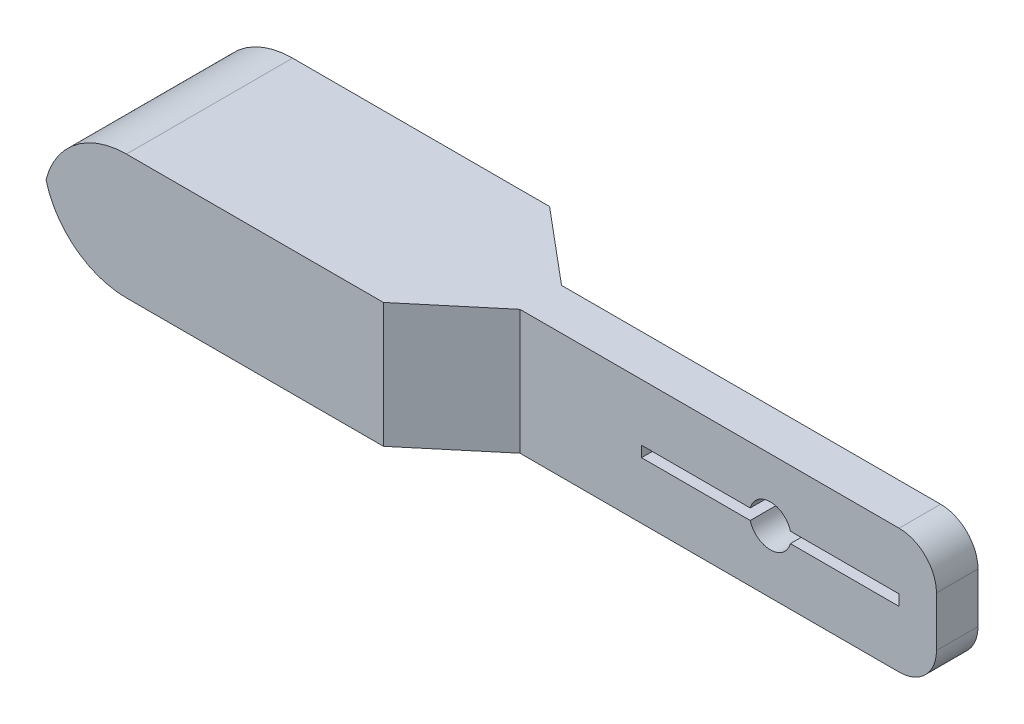
ISO-10303-21;
HEADER;
FILE_DESCRIPTION(('STEP AP214'),'2;1');
FILE_NAME('part.step','',(''),(''),'','','');
FILE_SCHEMA(('AUTOMOTIVE_DESIGN { 1 0 10303 214 1 1 1 1 }'));
ENDSEC;
DATA;
#1=APPLICATION_CONTEXT('core data for automotive mechanical design processes');
#2=APPLICATION_PROTOCOL_DEFINITION('international standard','automotive_design',2000,#1);
#3=PRODUCT_CONTEXT('',#1,'mechanical');
#4=PRODUCT('Part','Part','',(#3));
#5=PRODUCT_RELATED_PRODUCT_CATEGORY('part','',(#4));
#6=PRODUCT_DEFINITION_FORMATION('','',#4);
#7=PRODUCT_DEFINITION_CONTEXT('part definition',#1,'design');
#8=PRODUCT_DEFINITION('design','',#6,#7);
#9=PRODUCT_DEFINITION_SHAPE('','',#8);
#10=(LENGTH_UNIT() NAMED_UNIT(*) SI_UNIT(.MILLI.,.METRE.));
#11=(NAMED_UNIT(*) PLANE_ANGLE_UNIT() SI_UNIT($,.RADIAN.));
#12=(NAMED_UNIT(*) SI_UNIT($,.STERADIAN.) SOLID_ANGLE_UNIT());
#13=UNCERTAINTY_MEASURE_WITH_UNIT(LENGTH_MEASURE(1.E-05),#10,'distance_accuracy_value','');
#14=(GEOMETRIC_REPRESENTATION_CONTEXT(3) GLOBAL_UNCERTAINTY_ASSIGNED_CONTEXT((#13)) GLOBAL_UNIT_ASSIGNED_CONTEXT((#10,
#11,#12)) REPRESENTATION_CONTEXT('',''));
#15=CARTESIAN_POINT('',(0.,0.,0.));
#16=DIRECTION('',(0.,0.,1.));
#17=DIRECTION('',(1.,0.,0.));
#18=AXIS2_PLACEMENT_3D('',#15,#16,#17);
#19=CARTESIAN_POINT('',(0.,-6.,3.));
#20=DIRECTION('',(0.,-1.,0.));
#21=DIRECTION('',(0.,0.,1.));
#22=AXIS2_PLACEMENT_3D('',#19,#20,#21);
#23=PLANE('',#22);
#24=DIRECTION('',(1.,0.,0.));
#25=VECTOR('',#24,1.);
#26=CARTESIAN_POINT('',(0.,-6.,3.));
#27=LINE('',#26,#25);
#28=CARTESIAN_POINT('',(-27.629905537051,-6.,3.));
#29=VERTEX_POINT('',#28);
#30=CARTESIAN_POINT('',(18.,-6.,3.));
#31=VERTEX_POINT('',#30);
#32=EDGE_CURVE('E254',#29,#31,#27,.T.);
#33=ORIENTED_EDGE('',*,*,#32,.F.);
#34=DIRECTION('',(0.766044443118981,0.,-0.642787609686536));
#35=VECTOR('',#34,1.);
#36=CARTESIAN_POINT('',(-11.4160113957162,-6.,-10.6050725939414));
#37=LINE('',#36,#35);
#38=CARTESIAN_POINT('',(-36.5680574815077,-6.,10.5));
#39=VERTEX_POINT('',#38);
#40=EDGE_CURVE('E267',#39,#29,#37,.T.);
#41=ORIENTED_EDGE('',*,*,#40,.F.);
#42=DIRECTION('',(1.,0.,0.));
#43=VECTOR('',#42,1.);
#44=CARTESIAN_POINT('',(-77.5,-6.,10.5));
#45=LINE('',#44,#43);
#46=CARTESIAN_POINT('',(-67.5,-6.,10.5));
#47=VERTEX_POINT('',#46);
#48=EDGE_CURVE('E194',#47,#39,#45,.T.);
#49=ORIENTED_EDGE('',*,*,#48,.F.);
#50=DIRECTION('',(0.,0.,-1.));
#51=VECTOR('',#50,1.);
#52=CARTESIAN_POINT('',(-67.5,-6.,10.5));
#53=LINE('',#52,#51);
#54=CARTESIAN_POINT('',(-67.5,-6.,-9.5));
#55=VERTEX_POINT('',#54);
#56=EDGE_CURVE('E295',#55,#47,#53,.F.);
#57=ORIENTED_EDGE('',*,*,#56,.F.);
#58=DIRECTION('',(1.,0.,0.));
#59=VECTOR('',#58,1.);
#60=CARTESIAN_POINT('',(-77.5,-6.,-9.5));
#61=LINE('',#60,#59);
#62=CARTESIAN_POINT('',(-36.5680574815077,-6.,-9.5));
#63=VERTEX_POINT('',#62);
#64=EDGE_CURVE('E199',#55,#63,#61,.T.);
#65=ORIENTED_EDGE('',*,*,#64,.T.);
#66=DIRECTION('',(-0.766044443118981,0.,-0.642787609686536));
#67=VECTOR('',#66,1.);
#68=CARTESIAN_POINT('',(-8.9539920131857,-6.,13.670952149774));
#69=LINE('',#68,#67);
#70=CARTESIAN_POINT('',(-27.629905537051,-6.,-2.));
#71=VERTEX_POINT('',#70);
#72=EDGE_CURVE('E264',#71,#63,#69,.T.);
#73=ORIENTED_EDGE('',*,*,#72,.F.);
#74=DIRECTION('',(1.,0.,0.));
#75=VECTOR('',#74,1.);
#76=CARTESIAN_POINT('',(-17.5,-6.,-2.));
#77=LINE('',#76,#75);
#78=CARTESIAN_POINT('',(18.,-6.,-2.));
#79=VERTEX_POINT('',#78);
#80=EDGE_CURVE('E232',#71,#79,#77,.T.);
#81=ORIENTED_EDGE('',*,*,#80,.T.);
#82=DIRECTION('',(0.,0.,-1.));
#83=VECTOR('',#82,1.);
#84=CARTESIAN_POINT('',(18.,-6.,3.));
#85=LINE('',#84,#83);
#86=EDGE_CURVE('E298',#31,#79,#85,.T.);
#87=ORIENTED_EDGE('',*,*,#86,.F.);
#88=EDGE_LOOP('',(#33,#41,#49,#57,#65,#73,#81,#87));
#89=FACE_BOUND('',#88,.T.);
#90=ADVANCED_FACE('F37',(#89),#23,.T.);
#91=CARTESIAN_POINT('',(0.,9.,3.));
#92=DIRECTION('',(0.,-1.,0.));
#93=DIRECTION('',(0.,0.,1.));
#94=AXIS2_PLACEMENT_3D('',#91,#92,#93);
#95=PLANE('',#94);
#96=DIRECTION('',(-1.,0.,0.));
#97=VECTOR('',#96,1.);
#98=CARTESIAN_POINT('',(-17.5,9.,-2.));
#99=LINE('',#98,#97);
#100=CARTESIAN_POINT('',(18.,9.,-2.));
#101=VERTEX_POINT('',#100);
#102=CARTESIAN_POINT('',(-27.629905537051,9.,-2.));
#103=VERTEX_POINT('',#102);
#104=EDGE_CURVE('E251',#101,#103,#99,.T.);
#105=ORIENTED_EDGE('',*,*,#104,.T.);
#106=DIRECTION('',(0.766044443118981,0.,0.642787609686536));
#107=VECTOR('',#106,1.);
#108=CARTESIAN_POINT('',(-36.5680574815077,9.,-9.5));
#109=LINE('',#108,#107);
#110=CARTESIAN_POINT('',(-36.5680574815077,9.,-9.5));
#111=VERTEX_POINT('',#110);
#112=EDGE_CURVE('E270',#111,#103,#109,.T.);
#113=ORIENTED_EDGE('',*,*,#112,.F.);
#114=DIRECTION('',(1.,0.,0.));
#115=VECTOR('',#114,1.);
#116=CARTESIAN_POINT('',(-77.5,9.,-9.5));
#117=LINE('',#116,#115);
#118=CARTESIAN_POINT('',(-67.5,9.,-9.5));
#119=VERTEX_POINT('',#118);
#120=EDGE_CURVE('E340',#119,#111,#117,.T.);
#121=ORIENTED_EDGE('',*,*,#120,.F.);
#122=DIRECTION('',(0.,0.,1.));
#123=VECTOR('',#122,1.);
#124=CARTESIAN_POINT('',(-67.5,9.,3.));
#125=LINE('',#124,#123);
#126=CARTESIAN_POINT('',(-67.5,9.,10.5));
#127=VERTEX_POINT('',#126);
#128=EDGE_CURVE('E287',#127,#119,#125,.F.);
#129=ORIENTED_EDGE('',*,*,#128,.F.);
#130=DIRECTION('',(1.,0.,0.));
#131=VECTOR('',#130,1.);
#132=CARTESIAN_POINT('',(-77.5,9.,10.5));
#133=LINE('',#132,#131);
#134=CARTESIAN_POINT('',(-36.5680574815077,9.,10.5));
#135=VERTEX_POINT('',#134);
#136=EDGE_CURVE('E301',#127,#135,#133,.T.);
#137=ORIENTED_EDGE('',*,*,#136,.T.);
#138=DIRECTION('',(-0.766044443118981,0.,0.642787609686536));
#139=VECTOR('',#138,1.);
#140=CARTESIAN_POINT('',(-36.5680574815077,9.,10.5));
#141=LINE('',#140,#139);
#142=CARTESIAN_POINT('',(-27.629905537051,9.,3.));
#143=VERTEX_POINT('',#142);
#144=EDGE_CURVE('E273',#143,#135,#141,.T.);
#145=ORIENTED_EDGE('',*,*,#144,.F.);
#146=DIRECTION('',(1.,0.,0.));
#147=VECTOR('',#146,1.);
#148=CARTESIAN_POINT('',(0.,9.,3.));
#149=LINE('',#148,#147);
#150=CARTESIAN_POINT('',(18.,9.,3.));
#151=VERTEX_POINT('',#150);
#152=EDGE_CURVE('E259',#143,#151,#149,.T.);
#153=ORIENTED_EDGE('',*,*,#152,.T.);
#154=DIRECTION('',(0.,0.,-1.));
#155=VECTOR('',#154,1.);
#156=CARTESIAN_POINT('',(18.,9.,3.));
#157=LINE('',#156,#155);
#158=EDGE_CURVE('E11',#101,#151,#157,.F.);
#159=ORIENTED_EDGE('',*,*,#158,.F.);
#160=EDGE_LOOP('',(#105,#113,#121,#129,#137,#145,#153,#159));
#161=FACE_BOUND('',#160,.T.);
#162=ADVANCED_FACE('F346',(#161),#95,.F.);
#163=CARTESIAN_POINT('',(22.5,0.,3.));
#164=DIRECTION('',(1.,0.,0.));
#165=DIRECTION('',(0.,0.,1.));
#166=AXIS2_PLACEMENT_3D('',#163,#164,#165);
#167=PLANE('',#166);
#168=DIRECTION('',(0.,1.,0.));
#169=VECTOR('',#168,1.);
#170=CARTESIAN_POINT('',(22.5,-6.,-2.));
#171=LINE('',#170,#169);
#172=CARTESIAN_POINT('',(22.5,-1.5,-2.));
#173=VERTEX_POINT('',#172);
#174=CARTESIAN_POINT('',(22.5,4.5,-2.));
#175=VERTEX_POINT('',#174);
#176=EDGE_CURVE('E248',#173,#175,#171,.T.);
#177=ORIENTED_EDGE('',*,*,#176,.T.);
#178=DIRECTION('',(0.,0.,-1.));
#179=VECTOR('',#178,1.);
#180=CARTESIAN_POINT('',(22.5,4.5,-2.));
#181=LINE('',#180,#179);
#182=CARTESIAN_POINT('',(22.5,4.5,3.));
#183=VERTEX_POINT('',#182);
#184=EDGE_CURVE('E308',#183,#175,#181,.T.);
#185=ORIENTED_EDGE('',*,*,#184,.F.);
#186=DIRECTION('',(0.,1.,0.));
#187=VECTOR('',#186,1.);
#188=CARTESIAN_POINT('',(22.5,0.,3.));
#189=LINE('',#188,#187);
#190=CARTESIAN_POINT('',(22.5,-1.5,3.));
#191=VERTEX_POINT('',#190);
#192=EDGE_CURVE('E257',#191,#183,#189,.T.);
#193=ORIENTED_EDGE('',*,*,#192,.F.);
#194=DIRECTION('',(0.,0.,-1.));
#195=VECTOR('',#194,1.);
#196=CARTESIAN_POINT('',(22.5,-1.5,3.));
#197=LINE('',#196,#195);
#198=EDGE_CURVE('E310',#173,#191,#197,.F.);
#199=ORIENTED_EDGE('',*,*,#198,.F.);
#200=EDGE_LOOP('',(#177,#185,#193,#199));
#201=FACE_BOUND('',#200,.T.);
#202=ADVANCED_FACE('F359',(#201),#167,.T.);
#203=CARTESIAN_POINT('',(0.,0.,3.));
#204=DIRECTION('',(0.,0.,-1.));
#205=DIRECTION('',(1.,0.,0.));
#206=AXIS2_PLACEMENT_3D('',#203,#204,#205);
#207=PLANE('',#206);
#208=DIRECTION('',(-1.,0.,0.));
#209=VECTOR('',#208,1.);
#210=CARTESIAN_POINT('',(0.0859784590853366,0.850000000000001,3.));
#211=LINE('',#210,#209);
#212=CARTESIAN_POINT('',(0.0859784590853366,0.850000000000001,3.));
#213=VERTEX_POINT('',#212);
#214=CARTESIAN_POINT('',(-13.,0.849999999999999,3.));
#215=VERTEX_POINT('',#214);
#216=EDGE_CURVE('E210',#213,#215,#211,.T.);
#217=ORIENTED_EDGE('',*,*,#216,.T.);
#218=DIRECTION('',(0.,1.,0.));
#219=VECTOR('',#218,1.);
#220=CARTESIAN_POINT('',(-13.,2.15,3.));
#221=LINE('',#220,#219);
#222=CARTESIAN_POINT('',(-13.,2.15,3.));
#223=VERTEX_POINT('',#222);
#224=EDGE_CURVE('E207',#215,#223,#221,.T.);
#225=ORIENTED_EDGE('',*,*,#224,.T.);
#226=DIRECTION('',(1.,0.,0.));
#227=VECTOR('',#226,1.);
#228=CARTESIAN_POINT('',(0.0859784590853366,2.15,3.));
#229=LINE('',#228,#227);
#230=CARTESIAN_POINT('',(0.085978459085337,2.15,3.));
#231=VERTEX_POINT('',#230);
#232=EDGE_CURVE('E204',#223,#231,#229,.T.);
#233=ORIENTED_EDGE('',*,*,#232,.T.);
#234=CARTESIAN_POINT('',(2.5,1.5,3.));
#235=DIRECTION('',(0.,0.,1.));
#236=DIRECTION('',(1.,0.,0.));
#237=AXIS2_PLACEMENT_3D('',#234,#235,#236);
#238=CIRCLE('',#237,2.5);
#239=CARTESIAN_POINT('',(4.91402154091466,2.15,3.));
#240=VERTEX_POINT('',#239);
#241=EDGE_CURVE('E196',#231,#240,#238,.F.);
#242=ORIENTED_EDGE('',*,*,#241,.T.);
#243=DIRECTION('',(1.,0.,0.));
#244=VECTOR('',#243,1.);
#245=CARTESIAN_POINT('',(18.,2.15,3.));
#246=LINE('',#245,#244);
#247=CARTESIAN_POINT('',(18.,2.15,3.));
#248=VERTEX_POINT('',#247);
#249=EDGE_CURVE('E193',#240,#248,#246,.T.);
#250=ORIENTED_EDGE('',*,*,#249,.T.);
#251=DIRECTION('',(0.,-1.,0.));
#252=VECTOR('',#251,1.);
#253=CARTESIAN_POINT('',(18.,2.15,3.));
#254=LINE('',#253,#252);
#255=CARTESIAN_POINT('',(18.,0.850000000000004,3.));
#256=VERTEX_POINT('',#255);
#257=EDGE_CURVE('E170',#248,#256,#254,.T.);
#258=ORIENTED_EDGE('',*,*,#257,.T.);
#259=DIRECTION('',(-1.,0.,0.));
#260=VECTOR('',#259,1.);
#261=CARTESIAN_POINT('',(18.,0.850000000000004,3.));
#262=LINE('',#261,#260);
#263=CARTESIAN_POINT('',(4.91402154091466,0.850000000000001,3.));
#264=VERTEX_POINT('',#263);
#265=EDGE_CURVE('E181',#256,#264,#262,.T.);
#266=ORIENTED_EDGE('',*,*,#265,.T.);
#267=CARTESIAN_POINT('',(2.5,1.5,3.));
#268=DIRECTION('',(0.,0.,1.));
#269=DIRECTION('',(1.,0.,0.));
#270=AXIS2_PLACEMENT_3D('',#267,#268,#269);
#271=CIRCLE('',#270,2.5);
#272=EDGE_CURVE('E187',#264,#213,#271,.F.);
#273=ORIENTED_EDGE('',*,*,#272,.T.);
#274=EDGE_LOOP('',(#217,#225,#233,#242,#250,#258,#266,#273));
#275=FACE_BOUND('',#274,.T.);
#276=ORIENTED_EDGE('',*,*,#192,.T.);
#277=CARTESIAN_POINT('',(18.,4.5,3.));
#278=DIRECTION('',(0.,0.,1.));
#279=DIRECTION('',(1.,0.,0.));
#280=AXIS2_PLACEMENT_3D('',#277,#278,#279);
#281=CIRCLE('',#280,4.5);
#282=EDGE_CURVE('E52',#151,#183,#281,.F.);
#283=ORIENTED_EDGE('',*,*,#282,.F.);
#284=ORIENTED_EDGE('',*,*,#152,.F.);
#285=DIRECTION('',(0.,1.,0.));
#286=VECTOR('',#285,1.);
#287=CARTESIAN_POINT('',(-27.629905537051,0.,3.));
#288=LINE('',#287,#286);
#289=EDGE_CURVE('E278',#29,#143,#288,.T.);
#290=ORIENTED_EDGE('',*,*,#289,.F.);
#291=ORIENTED_EDGE('',*,*,#32,.T.);
#292=CARTESIAN_POINT('',(18.,-1.5,3.));
#293=DIRECTION('',(0.,0.,1.));
#294=DIRECTION('',(1.,0.,0.));
#295=AXIS2_PLACEMENT_3D('',#292,#293,#294);
#296=CIRCLE('',#295,4.5);
#297=EDGE_CURVE('E45',#191,#31,#296,.F.);
#298=ORIENTED_EDGE('',*,*,#297,.F.);
#299=EDGE_LOOP('',(#276,#283,#284,#290,#291,#298));
#300=FACE_BOUND('',#299,.T.);
#301=ADVANCED_FACE('F190',(#275,#300),#207,.F.);
#302=CARTESIAN_POINT('',(0.,0.,-2.));
#303=DIRECTION('',(0.,0.,1.));
#304=DIRECTION('',(-1.,0.,0.));
#305=AXIS2_PLACEMENT_3D('',#302,#303,#304);
#306=PLANE('',#305);
#307=DIRECTION('',(-1.,0.,0.));
#308=VECTOR('',#307,1.);
#309=CARTESIAN_POINT('',(0.0859784590853366,0.850000000000001,-2.));
#310=LINE('',#309,#308);
#311=CARTESIAN_POINT('',(0.0859784590853362,0.850000000000001,-2.));
#312=VERTEX_POINT('',#311);
#313=CARTESIAN_POINT('',(-13.,0.85,-2.));
#314=VERTEX_POINT('',#313);
#315=EDGE_CURVE('E217',#312,#314,#310,.T.);
#316=ORIENTED_EDGE('',*,*,#315,.F.);
#317=CARTESIAN_POINT('',(2.5,1.5,-2.));
#318=DIRECTION('',(0.,0.,-1.));
#319=DIRECTION('',(-1.,0.,0.));
#320=AXIS2_PLACEMENT_3D('',#317,#318,#319);
#321=CIRCLE('',#320,2.5);
#322=CARTESIAN_POINT('',(4.91402154091466,0.850000000000001,-2.));
#323=VERTEX_POINT('',#322);
#324=EDGE_CURVE('E229',#323,#312,#321,.T.);
#325=ORIENTED_EDGE('',*,*,#324,.F.);
#326=DIRECTION('',(-1.,0.,0.));
#327=VECTOR('',#326,1.);
#328=CARTESIAN_POINT('',(18.,0.850000000000004,-2.));
#329=LINE('',#328,#327);
#330=CARTESIAN_POINT('',(18.,0.850000000000003,-2.));
#331=VERTEX_POINT('',#330);
#332=EDGE_CURVE('E227',#331,#323,#329,.T.);
#333=ORIENTED_EDGE('',*,*,#332,.F.);
#334=DIRECTION('',(0.,-1.,0.));
#335=VECTOR('',#334,1.);
#336=CARTESIAN_POINT('',(18.,2.15,-2.));
#337=LINE('',#336,#335);
#338=CARTESIAN_POINT('',(18.,2.15,-2.));
#339=VERTEX_POINT('',#338);
#340=EDGE_CURVE('E173',#339,#331,#337,.T.);
#341=ORIENTED_EDGE('',*,*,#340,.F.);
#342=DIRECTION('',(1.,0.,0.));
#343=VECTOR('',#342,1.);
#344=CARTESIAN_POINT('',(18.,2.15,-2.));
#345=LINE('',#344,#343);
#346=CARTESIAN_POINT('',(4.91402154091466,2.15,-2.));
#347=VERTEX_POINT('',#346);
#348=EDGE_CURVE('E223',#347,#339,#345,.T.);
#349=ORIENTED_EDGE('',*,*,#348,.F.);
#350=CARTESIAN_POINT('',(2.5,1.5,-2.));
#351=DIRECTION('',(0.,0.,-1.));
#352=DIRECTION('',(-1.,0.,0.));
#353=AXIS2_PLACEMENT_3D('',#350,#351,#352);
#354=CIRCLE('',#353,2.5);
#355=CARTESIAN_POINT('',(0.0859784590853366,2.15,-2.));
#356=VERTEX_POINT('',#355);
#357=EDGE_CURVE('E220',#356,#347,#354,.T.);
#358=ORIENTED_EDGE('',*,*,#357,.F.);
#359=DIRECTION('',(1.,0.,0.));
#360=VECTOR('',#359,1.);
#361=CARTESIAN_POINT('',(0.0859784590853366,2.15,-2.));
#362=LINE('',#361,#360);
#363=CARTESIAN_POINT('',(-13.,2.15,-2.));
#364=VERTEX_POINT('',#363);
#365=EDGE_CURVE('E216',#364,#356,#362,.T.);
#366=ORIENTED_EDGE('',*,*,#365,.F.);
#367=DIRECTION('',(0.,1.,0.));
#368=VECTOR('',#367,1.);
#369=CARTESIAN_POINT('',(-13.,2.15,-2.));
#370=LINE('',#369,#368);
#371=EDGE_CURVE('E213',#314,#364,#370,.T.);
#372=ORIENTED_EDGE('',*,*,#371,.F.);
#373=EDGE_LOOP('',(#316,#325,#333,#341,#349,#358,#366,#372));
#374=FACE_BOUND('',#373,.T.);
#375=ORIENTED_EDGE('',*,*,#80,.F.);
#376=DIRECTION('',(0.,-1.,0.));
#377=VECTOR('',#376,1.);
#378=CARTESIAN_POINT('',(-27.629905537051,0.,-2.));
#379=LINE('',#378,#377);
#380=EDGE_CURVE('E280',#103,#71,#379,.T.);
#381=ORIENTED_EDGE('',*,*,#380,.F.);
#382=ORIENTED_EDGE('',*,*,#104,.F.);
#383=CARTESIAN_POINT('',(18.,4.5,-2.));
#384=DIRECTION('',(0.,0.,-1.));
#385=DIRECTION('',(-1.,0.,0.));
#386=AXIS2_PLACEMENT_3D('',#383,#384,#385);
#387=CIRCLE('',#386,4.5);
#388=EDGE_CURVE('E304',#175,#101,#387,.F.);
#389=ORIENTED_EDGE('',*,*,#388,.F.);
#390=ORIENTED_EDGE('',*,*,#176,.F.);
#391=CARTESIAN_POINT('',(18.,-1.5,-2.));
#392=DIRECTION('',(0.,0.,-1.));
#393=DIRECTION('',(-1.,0.,0.));
#394=AXIS2_PLACEMENT_3D('',#391,#392,#393);
#395=CIRCLE('',#394,4.5);
#396=EDGE_CURVE('E306',#79,#173,#395,.F.);
#397=ORIENTED_EDGE('',*,*,#396,.F.);
#398=EDGE_LOOP('',(#375,#381,#382,#389,#390,#397));
#399=FACE_BOUND('',#398,.T.);
#400=ADVANCED_FACE('F356',(#374,#399),#306,.F.);
#401=CARTESIAN_POINT('',(0.0859784590853366,0.850000000000001,-33.4006369362152));
#402=DIRECTION('',(0.,1.,0.));
#403=DIRECTION('',(-1.,0.,0.));
#404=AXIS2_PLACEMENT_3D('',#401,#402,#403);
#405=PLANE('',#404);
#406=DIRECTION('',(0.,0.,1.));
#407=VECTOR('',#406,1.);
#408=CARTESIAN_POINT('',(0.0859784590853366,0.850000000000001,-33.4006369362152));
#409=LINE('',#408,#407);
#410=EDGE_CURVE('E186',#312,#213,#409,.T.);
#411=ORIENTED_EDGE('',*,*,#410,.F.);
#412=ORIENTED_EDGE('',*,*,#315,.T.);
#413=DIRECTION('',(0.,0.,1.));
#414=VECTOR('',#413,1.);
#415=CARTESIAN_POINT('',(-13.,0.85,-33.4006369362152));
#416=LINE('',#415,#414);
#417=EDGE_CURVE('E234',#314,#215,#416,.T.);
#418=ORIENTED_EDGE('',*,*,#417,.T.);
#419=ORIENTED_EDGE('',*,*,#216,.F.);
#420=EDGE_LOOP('',(#411,#412,#418,#419));
#421=FACE_BOUND('',#420,.T.);
#422=ADVANCED_FACE('F451',(#421),#405,.T.);
#423=CARTESIAN_POINT('',(-13.,2.15,-33.4006369362152));
#424=DIRECTION('',(1.,0.,0.));
#425=DIRECTION('',(0.,0.,1.));
#426=AXIS2_PLACEMENT_3D('',#423,#424,#425);
#427=PLANE('',#426);
#428=ORIENTED_EDGE('',*,*,#417,.F.);
#429=ORIENTED_EDGE('',*,*,#371,.T.);
#430=DIRECTION('',(0.,0.,1.));
#431=VECTOR('',#430,1.);
#432=CARTESIAN_POINT('',(-13.,2.15,-33.4006369362152));
#433=LINE('',#432,#431);
#434=EDGE_CURVE('E236',#364,#223,#433,.T.);
#435=ORIENTED_EDGE('',*,*,#434,.T.);
#436=ORIENTED_EDGE('',*,*,#224,.F.);
#437=EDGE_LOOP('',(#428,#429,#435,#436));
#438=FACE_BOUND('',#437,.T.);
#439=ADVANCED_FACE('F442',(#438),#427,.T.);
#440=CARTESIAN_POINT('',(0.0859784590853366,2.15,-33.4006369362152));
#441=DIRECTION('',(0.,-1.,0.));
#442=DIRECTION('',(1.,0.,0.));
#443=AXIS2_PLACEMENT_3D('',#440,#441,#442);
#444=PLANE('',#443);
#445=ORIENTED_EDGE('',*,*,#434,.F.);
#446=ORIENTED_EDGE('',*,*,#365,.T.);
#447=DIRECTION('',(0.,0.,1.));
#448=VECTOR('',#447,1.);
#449=CARTESIAN_POINT('',(0.0859784590853366,2.15,-33.4006369362152));
#450=LINE('',#449,#448);
#451=EDGE_CURVE('E238',#356,#231,#450,.T.);
#452=ORIENTED_EDGE('',*,*,#451,.T.);
#453=ORIENTED_EDGE('',*,*,#232,.F.);
#454=EDGE_LOOP('',(#445,#446,#452,#453));
#455=FACE_BOUND('',#454,.T.);
#456=ADVANCED_FACE('F433',(#455),#444,.T.);
#457=CARTESIAN_POINT('',(2.5,1.5,-33.4006369362152));
#458=DIRECTION('',(0.,0.,1.));
#459=DIRECTION('',(-1.,0.,0.));
#460=AXIS2_PLACEMENT_3D('',#457,#458,#459);
#461=CYLINDRICAL_SURFACE('',#460,2.5);
#462=ORIENTED_EDGE('',*,*,#451,.F.);
#463=ORIENTED_EDGE('',*,*,#357,.T.);
#464=DIRECTION('',(0.,0.,1.));
#465=VECTOR('',#464,1.);
#466=CARTESIAN_POINT('',(4.91402154091466,2.15,-33.4006369362152));
#467=LINE('',#466,#465);
#468=EDGE_CURVE('E240',#347,#240,#467,.T.);
#469=ORIENTED_EDGE('',*,*,#468,.T.);
#470=ORIENTED_EDGE('',*,*,#241,.F.);
#471=EDGE_LOOP('',(#462,#463,#469,#470));
#472=FACE_BOUND('',#471,.T.);
#473=ADVANCED_FACE('F424',(#472),#461,.F.);
#474=CARTESIAN_POINT('',(18.,2.15,-33.4006369362152));
#475=DIRECTION('',(0.,-1.,0.));
#476=DIRECTION('',(1.,0.,0.));
#477=AXIS2_PLACEMENT_3D('',#474,#475,#476);
#478=PLANE('',#477);
#479=ORIENTED_EDGE('',*,*,#468,.F.);
#480=ORIENTED_EDGE('',*,*,#348,.T.);
#481=DIRECTION('',(0.,0.,1.));
#482=VECTOR('',#481,1.);
#483=CARTESIAN_POINT('',(18.,2.15,-33.4006369362152));
#484=LINE('',#483,#482);
#485=EDGE_CURVE('E178',#339,#248,#484,.T.);
#486=ORIENTED_EDGE('',*,*,#485,.T.);
#487=ORIENTED_EDGE('',*,*,#249,.F.);
#488=EDGE_LOOP('',(#479,#480,#486,#487));
#489=FACE_BOUND('',#488,.T.);
#490=ADVANCED_FACE('F415',(#489),#478,.T.);
#491=CARTESIAN_POINT('',(18.,2.15,-33.4006369362152));
#492=DIRECTION('',(-1.,0.,0.));
#493=DIRECTION('',(0.,0.,-1.));
#494=AXIS2_PLACEMENT_3D('',#491,#492,#493);
#495=PLANE('',#494);
#496=ORIENTED_EDGE('',*,*,#485,.F.);
#497=ORIENTED_EDGE('',*,*,#340,.T.);
#498=DIRECTION('',(0.,0.,1.));
#499=VECTOR('',#498,1.);
#500=CARTESIAN_POINT('',(18.,0.850000000000004,-33.4006369362152));
#501=LINE('',#500,#499);
#502=EDGE_CURVE('E166',#331,#256,#501,.T.);
#503=ORIENTED_EDGE('',*,*,#502,.T.);
#504=ORIENTED_EDGE('',*,*,#257,.F.);
#505=EDGE_LOOP('',(#496,#497,#503,#504));
#506=FACE_BOUND('',#505,.T.);
#507=ADVANCED_FACE('F168',(#506),#495,.T.);
#508=CARTESIAN_POINT('',(18.,0.850000000000004,-33.4006369362152));
#509=DIRECTION('',(0.,1.,0.));
#510=DIRECTION('',(-1.,0.,0.));
#511=AXIS2_PLACEMENT_3D('',#508,#509,#510);
#512=PLANE('',#511);
#513=ORIENTED_EDGE('',*,*,#502,.F.);
#514=ORIENTED_EDGE('',*,*,#332,.T.);
#515=DIRECTION('',(0.,0.,1.));
#516=VECTOR('',#515,1.);
#517=CARTESIAN_POINT('',(4.91402154091466,0.850000000000001,-33.4006369362152));
#518=LINE('',#517,#516);
#519=EDGE_CURVE('E177',#323,#264,#518,.T.);
#520=ORIENTED_EDGE('',*,*,#519,.T.);
#521=ORIENTED_EDGE('',*,*,#265,.F.);
#522=EDGE_LOOP('',(#513,#514,#520,#521));
#523=FACE_BOUND('',#522,.T.);
#524=ADVANCED_FACE('F182',(#523),#512,.T.);
#525=CARTESIAN_POINT('',(2.5,1.5,-33.4006369362152));
#526=DIRECTION('',(0.,0.,1.));
#527=DIRECTION('',(-1.,0.,0.));
#528=AXIS2_PLACEMENT_3D('',#525,#526,#527);
#529=CYLINDRICAL_SURFACE('',#528,2.5);
#530=ORIENTED_EDGE('',*,*,#519,.F.);
#531=ORIENTED_EDGE('',*,*,#324,.T.);
#532=ORIENTED_EDGE('',*,*,#410,.T.);
#533=ORIENTED_EDGE('',*,*,#272,.F.);
#534=EDGE_LOOP('',(#530,#531,#532,#533));
#535=FACE_BOUND('',#534,.T.);
#536=ADVANCED_FACE('F499',(#535),#529,.F.);
#537=CARTESIAN_POINT('',(-77.5,-6.,10.5));
#538=DIRECTION('',(0.,0.,-1.));
#539=DIRECTION('',(0.,-1.,0.));
#540=AXIS2_PLACEMENT_3D('',#537,#538,#539);
#541=PLANE('',#540);
#542=CARTESIAN_POINT('',(-67.5,4.,10.5));
#543=DIRECTION('',(0.,0.,1.));
#544=DIRECTION('',(0.,-1.,0.));
#545=AXIS2_PLACEMENT_3D('',#542,#543,#544);
#546=CIRCLE('',#545,10.);
#547=CARTESIAN_POINT('',(-77.1824583655185,1.5,10.5));
#548=VERTEX_POINT('',#547);
#549=EDGE_CURVE('E282',#47,#548,#546,.F.);
#550=ORIENTED_EDGE('',*,*,#549,.F.);
#551=ORIENTED_EDGE('',*,*,#48,.T.);
#552=DIRECTION('',(0.,-1.,0.));
#553=VECTOR('',#552,1.);
#554=CARTESIAN_POINT('',(-36.5680574815077,-6.,10.5));
#555=LINE('',#554,#553);
#556=EDGE_CURVE('E262',#135,#39,#555,.T.);
#557=ORIENTED_EDGE('',*,*,#556,.F.);
#558=ORIENTED_EDGE('',*,*,#136,.F.);
#559=CARTESIAN_POINT('',(-67.5,-0.999999999999999,10.5));
#560=DIRECTION('',(0.,0.,1.));
#561=DIRECTION('',(0.,-1.,0.));
#562=AXIS2_PLACEMENT_3D('',#559,#560,#561);
#563=CIRCLE('',#562,10.);
#564=EDGE_CURVE('E285',#548,#127,#563,.F.);
#565=ORIENTED_EDGE('',*,*,#564,.F.);
#566=EDGE_LOOP('',(#550,#551,#557,#558,#565));
#567=FACE_BOUND('',#566,.T.);
#568=ADVANCED_FACE('F330',(#567),#541,.F.);
#569=CARTESIAN_POINT('',(-77.5,-6.,-9.5));
#570=DIRECTION('',(0.,0.,1.));
#571=DIRECTION('',(0.,1.,0.));
#572=AXIS2_PLACEMENT_3D('',#569,#570,#571);
#573=PLANE('',#572);
#574=ORIENTED_EDGE('',*,*,#120,.T.);
#575=DIRECTION('',(0.,1.,0.));
#576=VECTOR('',#575,1.);
#577=CARTESIAN_POINT('',(-36.5680574815077,9.,-9.5));
#578=LINE('',#577,#576);
#579=EDGE_CURVE('E276',#63,#111,#578,.T.);
#580=ORIENTED_EDGE('',*,*,#579,.F.);
#581=ORIENTED_EDGE('',*,*,#64,.F.);
#582=CARTESIAN_POINT('',(-67.5,4.,-9.5));
#583=DIRECTION('',(0.,0.,-1.));
#584=DIRECTION('',(0.,1.,0.));
#585=AXIS2_PLACEMENT_3D('',#582,#583,#584);
#586=CIRCLE('',#585,10.);
#587=CARTESIAN_POINT('',(-77.1824583655185,1.5,-9.5));
#588=VERTEX_POINT('',#587);
#589=EDGE_CURVE('E290',#588,#55,#586,.F.);
#590=ORIENTED_EDGE('',*,*,#589,.F.);
#591=CARTESIAN_POINT('',(-67.5,-0.999999999999999,-9.5));
#592=DIRECTION('',(0.,0.,-1.));
#593=DIRECTION('',(0.,1.,0.));
#594=AXIS2_PLACEMENT_3D('',#591,#592,#593);
#595=CIRCLE('',#594,10.);
#596=EDGE_CURVE('E292',#119,#588,#595,.F.);
#597=ORIENTED_EDGE('',*,*,#596,.F.);
#598=EDGE_LOOP('',(#574,#580,#581,#590,#597));
#599=FACE_BOUND('',#598,.T.);
#600=ADVANCED_FACE('F339',(#599),#573,.F.);
#601=CARTESIAN_POINT('',(-36.5680574815077,-6.,10.5));
#602=DIRECTION('',(0.642787609686536,0.,0.766044443118981));
#603=DIRECTION('',(0.,1.,0.));
#604=AXIS2_PLACEMENT_3D('',#601,#602,#603);
#605=PLANE('',#604);
#606=ORIENTED_EDGE('',*,*,#144,.T.);
#607=ORIENTED_EDGE('',*,*,#556,.T.);
#608=ORIENTED_EDGE('',*,*,#40,.T.);
#609=ORIENTED_EDGE('',*,*,#289,.T.);
#610=EDGE_LOOP('',(#606,#607,#608,#609));
#611=FACE_BOUND('',#610,.T.);
#612=ADVANCED_FACE('F325',(#611),#605,.T.);
#613=CARTESIAN_POINT('',(-36.5680574815077,-6.,-9.5));
#614=DIRECTION('',(0.642787609686536,0.,-0.766044443118981));
#615=DIRECTION('',(0.,-1.,0.));
#616=AXIS2_PLACEMENT_3D('',#613,#614,#615);
#617=PLANE('',#616);
#618=ORIENTED_EDGE('',*,*,#72,.T.);
#619=ORIENTED_EDGE('',*,*,#579,.T.);
#620=ORIENTED_EDGE('',*,*,#112,.T.);
#621=ORIENTED_EDGE('',*,*,#380,.T.);
#622=EDGE_LOOP('',(#618,#619,#620,#621));
#623=FACE_BOUND('',#622,.T.);
#624=ADVANCED_FACE('F354',(#623),#617,.T.);
#625=CARTESIAN_POINT('',(-67.5,4.,0.));
#626=DIRECTION('',(0.,0.,1.));
#627=DIRECTION('',(-1.,0.,0.));
#628=AXIS2_PLACEMENT_3D('',#625,#626,#627);
#629=CYLINDRICAL_SURFACE('',#628,10.);
#630=ORIENTED_EDGE('',*,*,#56,.T.);
#631=ORIENTED_EDGE('',*,*,#549,.T.);
#632=DIRECTION('',(0.,0.,1.));
#633=VECTOR('',#632,1.);
#634=CARTESIAN_POINT('',(-77.1824583655185,1.5,0.5));
#635=LINE('',#634,#633);
#636=EDGE_CURVE('E299',#548,#588,#635,.F.);
#637=ORIENTED_EDGE('',*,*,#636,.T.);
#638=ORIENTED_EDGE('',*,*,#589,.T.);
#639=EDGE_LOOP('',(#630,#631,#637,#638));
#640=FACE_BOUND('',#639,.T.);
#641=ADVANCED_FACE('F334',(#640),#629,.T.);
#642=CARTESIAN_POINT('',(-67.5,-0.999999999999999,0.));
#643=DIRECTION('',(0.,0.,1.));
#644=DIRECTION('',(-1.,0.,0.));
#645=AXIS2_PLACEMENT_3D('',#642,#643,#644);
#646=CYLINDRICAL_SURFACE('',#645,10.);
#647=ORIENTED_EDGE('',*,*,#596,.T.);
#648=ORIENTED_EDGE('',*,*,#636,.F.);
#649=ORIENTED_EDGE('',*,*,#564,.T.);
#650=ORIENTED_EDGE('',*,*,#128,.T.);
#651=EDGE_LOOP('',(#647,#648,#649,#650));
#652=FACE_BOUND('',#651,.T.);
#653=ADVANCED_FACE('F350',(#652),#646,.T.);
#654=CARTESIAN_POINT('',(18.,-1.5,3.));
#655=DIRECTION('',(0.,0.,-1.));
#656=DIRECTION('',(1.,0.,0.));
#657=AXIS2_PLACEMENT_3D('',#654,#655,#656);
#658=CYLINDRICAL_SURFACE('',#657,4.5);
#659=ORIENTED_EDGE('',*,*,#297,.T.);
#660=ORIENTED_EDGE('',*,*,#86,.T.);
#661=ORIENTED_EDGE('',*,*,#396,.T.);
#662=ORIENTED_EDGE('',*,*,#198,.T.);
#663=EDGE_LOOP('',(#659,#660,#661,#662));
#664=FACE_BOUND('',#663,.T.);
#665=ADVANCED_FACE('F315',(#664),#658,.T.);
#666=CARTESIAN_POINT('',(18.,4.5,3.));
#667=DIRECTION('',(0.,0.,1.));
#668=DIRECTION('',(-1.,0.,0.));
#669=AXIS2_PLACEMENT_3D('',#666,#667,#668);
#670=CYLINDRICAL_SURFACE('',#669,4.5);
#671=ORIENTED_EDGE('',*,*,#282,.T.);
#672=ORIENTED_EDGE('',*,*,#184,.T.);
#673=ORIENTED_EDGE('',*,*,#388,.T.);
#674=ORIENTED_EDGE('',*,*,#158,.T.);
#675=EDGE_LOOP('',(#671,#672,#673,#674));
#676=FACE_BOUND('',#675,.T.);
#677=ADVANCED_FACE('F39',(#676),#670,.T.);
#678=CLOSED_SHELL('',(#90,#162,#202,#301,#400,#422,#439,#456,#473,#490,#507,#524,#536,#568,#600,
#612,#624,#641,#653,#665,#677));
#679=MANIFOLD_SOLID_BREP('B2',#678);
#680=ADVANCED_BREP_SHAPE_REPRESENTATION('',(#18,#679),#14);
#681=SHAPE_DEFINITION_REPRESENTATION(#9,#680);
ENDSEC;
END-ISO-10303-21;
